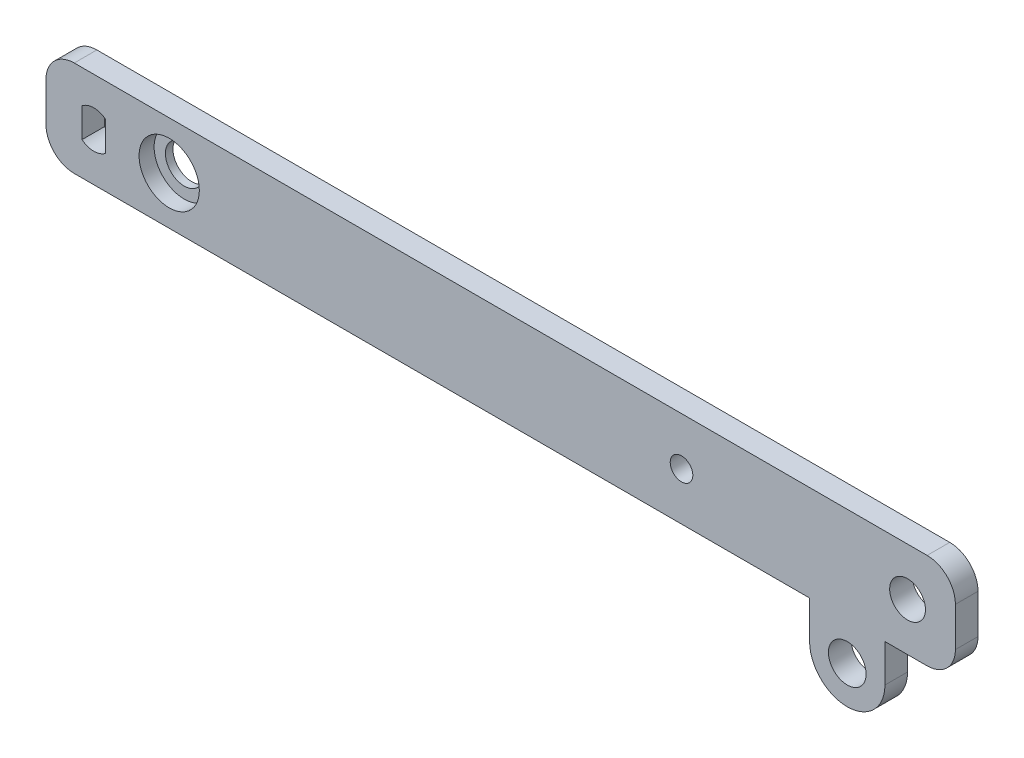
ISO-10303-21;
HEADER;
FILE_DESCRIPTION(('STEP AP214'),'2;1');
FILE_NAME('part.step','',(''),(''),'','','');
FILE_SCHEMA(('AUTOMOTIVE_DESIGN { 1 0 10303 214 1 1 1 1 }'));
ENDSEC;
DATA;
#1=APPLICATION_CONTEXT('core data for automotive mechanical design processes');
#2=APPLICATION_PROTOCOL_DEFINITION('international standard','automotive_design',2000,#1);
#3=PRODUCT_CONTEXT('',#1,'mechanical');
#4=PRODUCT('Part','Part','',(#3));
#5=PRODUCT_RELATED_PRODUCT_CATEGORY('part','',(#4));
#6=PRODUCT_DEFINITION_FORMATION('','',#4);
#7=PRODUCT_DEFINITION_CONTEXT('part definition',#1,'design');
#8=PRODUCT_DEFINITION('design','',#6,#7);
#9=PRODUCT_DEFINITION_SHAPE('','',#8);
#10=(LENGTH_UNIT() NAMED_UNIT(*) SI_UNIT(.MILLI.,.METRE.));
#11=(NAMED_UNIT(*) PLANE_ANGLE_UNIT() SI_UNIT($,.RADIAN.));
#12=(NAMED_UNIT(*) SI_UNIT($,.STERADIAN.) SOLID_ANGLE_UNIT());
#13=UNCERTAINTY_MEASURE_WITH_UNIT(LENGTH_MEASURE(1.E-05),#10,'distance_accuracy_value','');
#14=(GEOMETRIC_REPRESENTATION_CONTEXT(3) GLOBAL_UNCERTAINTY_ASSIGNED_CONTEXT((#13)) GLOBAL_UNIT_ASSIGNED_CONTEXT((#10,
#11,#12)) REPRESENTATION_CONTEXT('',''));
#15=CARTESIAN_POINT('',(0.,0.,0.));
#16=DIRECTION('',(0.,0.,1.));
#17=DIRECTION('',(1.,0.,0.));
#18=AXIS2_PLACEMENT_3D('',#15,#16,#17);
#19=CARTESIAN_POINT('',(40.,0.,12.));
#20=DIRECTION('',(0.,0.,-1.));
#21=DIRECTION('',(-1.,0.,0.));
#22=AXIS2_PLACEMENT_3D('',#19,#20,#21);
#23=CYLINDRICAL_SURFACE('',#22,10.);
#24=CARTESIAN_POINT('',(40.,0.,0.));
#25=DIRECTION('',(0.,0.,1.));
#26=DIRECTION('',(1.,0.,0.));
#27=AXIS2_PLACEMENT_3D('',#24,#25,#26);
#28=CIRCLE('',#27,10.);
#29=CARTESIAN_POINT('',(50.,0.,0.));
#30=VERTEX_POINT('',#29);
#31=EDGE_CURVE('E188',#30,#30,#28,.T.);
#32=ORIENTED_EDGE('',*,*,#31,.F.);
#33=EDGE_LOOP('',(#32));
#34=FACE_BOUND('',#33,.T.);
#35=CARTESIAN_POINT('',(40.,0.,4.));
#36=DIRECTION('',(0.,0.,1.));
#37=DIRECTION('',(1.,0.,0.));
#38=AXIS2_PLACEMENT_3D('',#35,#36,#37);
#39=CIRCLE('',#38,10.);
#40=CARTESIAN_POINT('',(50.,0.,4.));
#41=VERTEX_POINT('',#40);
#42=EDGE_CURVE('E41',#41,#41,#39,.T.);
#43=ORIENTED_EDGE('',*,*,#42,.T.);
#44=EDGE_LOOP('',(#43));
#45=FACE_BOUND('',#44,.T.);
#46=ADVANCED_FACE('F37',(#34,#45),#23,.F.);
#47=CARTESIAN_POINT('',(400.,-45.4,12.));
#48=DIRECTION('',(0.,0.,1.));
#49=DIRECTION('',(1.,0.,0.));
#50=AXIS2_PLACEMENT_3D('',#47,#48,#49);
#51=PLANE('',#50);
#52=CARTESIAN_POINT('',(40.,0.,12.));
#53=DIRECTION('',(0.,0.,1.));
#54=DIRECTION('',(1.,0.,0.));
#55=AXIS2_PLACEMENT_3D('',#52,#53,#54);
#56=CIRCLE('',#55,16.);
#57=CARTESIAN_POINT('',(56.,0.,12.));
#58=VERTEX_POINT('',#57);
#59=EDGE_CURVE('E494',#58,#58,#56,.T.);
#60=ORIENTED_EDGE('',*,*,#59,.F.);
#61=EDGE_LOOP('',(#60));
#62=FACE_BOUND('',#61,.T.);
#63=CARTESIAN_POINT('',(312.,0.,12.));
#64=DIRECTION('',(0.,0.,1.));
#65=DIRECTION('',(1.,0.,0.));
#66=AXIS2_PLACEMENT_3D('',#63,#64,#65);
#67=CIRCLE('',#66,5.99999999999999);
#68=CARTESIAN_POINT('',(318.,0.,12.));
#69=VERTEX_POINT('',#68);
#70=EDGE_CURVE('E478',#69,#69,#67,.T.);
#71=ORIENTED_EDGE('',*,*,#70,.F.);
#72=EDGE_LOOP('',(#71));
#73=FACE_BOUND('',#72,.T.);
#74=DIRECTION('',(0.,-1.,0.));
#75=VECTOR('',#74,1.);
#76=CARTESIAN_POINT('',(-6.28,-7.7821333835909,12.));
#77=LINE('',#76,#75);
#78=CARTESIAN_POINT('',(-6.28,7.7821333835909,12.));
#79=VERTEX_POINT('',#78);
#80=CARTESIAN_POINT('',(-6.28000000000001,-7.7821333835909,12.));
#81=VERTEX_POINT('',#80);
#82=EDGE_CURVE('E165',#79,#81,#77,.T.);
#83=ORIENTED_EDGE('',*,*,#82,.F.);
#84=CARTESIAN_POINT('',(0.,0.,12.));
#85=DIRECTION('',(0.,0.,1.));
#86=DIRECTION('',(1.,0.,0.));
#87=AXIS2_PLACEMENT_3D('',#84,#85,#86);
#88=CIRCLE('',#87,10.);
#89=CARTESIAN_POINT('',(6.28,7.7821333835909,12.));
#90=VERTEX_POINT('',#89);
#91=EDGE_CURVE('E155',#90,#79,#88,.T.);
#92=ORIENTED_EDGE('',*,*,#91,.F.);
#93=DIRECTION('',(0.,1.,0.));
#94=VECTOR('',#93,1.);
#95=CARTESIAN_POINT('',(6.28,-7.7821333835909,12.));
#96=LINE('',#95,#94);
#97=CARTESIAN_POINT('',(6.28000000000001,-7.7821333835909,12.));
#98=VERTEX_POINT('',#97);
#99=EDGE_CURVE('E181',#98,#90,#96,.T.);
#100=ORIENTED_EDGE('',*,*,#99,.F.);
#101=CARTESIAN_POINT('',(0.,0.,12.));
#102=DIRECTION('',(0.,0.,1.));
#103=DIRECTION('',(1.,0.,0.));
#104=AXIS2_PLACEMENT_3D('',#101,#102,#103);
#105=CIRCLE('',#104,10.);
#106=EDGE_CURVE('E179',#81,#98,#105,.T.);
#107=ORIENTED_EDGE('',*,*,#106,.F.);
#108=EDGE_LOOP('',(#83,#92,#100,#107));
#109=FACE_BOUND('',#108,.T.);
#110=DIRECTION('',(1.,0.,0.));
#111=VECTOR('',#110,1.);
#112=CARTESIAN_POINT('',(420.,-25.4,12.));
#113=LINE('',#112,#111);
#114=CARTESIAN_POINT('',(420.,-25.4,12.));
#115=VERTEX_POINT('',#114);
#116=CARTESIAN_POINT('',(442.4,-25.4,12.));
#117=VERTEX_POINT('',#116);
#118=EDGE_CURVE('E217',#115,#117,#113,.T.);
#119=ORIENTED_EDGE('',*,*,#118,.T.);
#120=CARTESIAN_POINT('',(442.4,-10.4,12.));
#121=DIRECTION('',(0.,0.,1.));
#122=DIRECTION('',(1.,0.,0.));
#123=AXIS2_PLACEMENT_3D('',#120,#121,#122);
#124=CIRCLE('',#123,15.);
#125=CARTESIAN_POINT('',(457.4,-10.4,12.));
#126=VERTEX_POINT('',#125);
#127=EDGE_CURVE('E46',#117,#126,#124,.T.);
#128=ORIENTED_EDGE('',*,*,#127,.T.);
#129=DIRECTION('',(0.,1.,0.));
#130=VECTOR('',#129,1.);
#131=CARTESIAN_POINT('',(457.4,25.4,12.));
#132=LINE('',#131,#130);
#133=CARTESIAN_POINT('',(457.4,10.4,12.));
#134=VERTEX_POINT('',#133);
#135=EDGE_CURVE('E219',#126,#134,#132,.T.);
#136=ORIENTED_EDGE('',*,*,#135,.T.);
#137=CARTESIAN_POINT('',(442.4,10.4,12.));
#138=DIRECTION('',(0.,0.,1.));
#139=DIRECTION('',(1.,0.,0.));
#140=AXIS2_PLACEMENT_3D('',#137,#138,#139);
#141=CIRCLE('',#140,15.);
#142=CARTESIAN_POINT('',(442.4,25.4,12.));
#143=VERTEX_POINT('',#142);
#144=EDGE_CURVE('E53',#134,#143,#141,.T.);
#145=ORIENTED_EDGE('',*,*,#144,.T.);
#146=DIRECTION('',(-1.,0.,0.));
#147=VECTOR('',#146,1.);
#148=CARTESIAN_POINT('',(-25.4,25.4,12.));
#149=LINE('',#148,#147);
#150=CARTESIAN_POINT('',(-10.4,25.4,12.));
#151=VERTEX_POINT('',#150);
#152=EDGE_CURVE('E221',#143,#151,#149,.T.);
#153=ORIENTED_EDGE('',*,*,#152,.T.);
#154=CARTESIAN_POINT('',(-10.4,10.4,12.));
#155=DIRECTION('',(0.,0.,1.));
#156=DIRECTION('',(1.,0.,0.));
#157=AXIS2_PLACEMENT_3D('',#154,#155,#156);
#158=CIRCLE('',#157,15.);
#159=CARTESIAN_POINT('',(-25.4,10.4,12.));
#160=VERTEX_POINT('',#159);
#161=EDGE_CURVE('E264',#151,#160,#158,.T.);
#162=ORIENTED_EDGE('',*,*,#161,.T.);
#163=DIRECTION('',(0.,-1.,0.));
#164=VECTOR('',#163,1.);
#165=CARTESIAN_POINT('',(-25.4,25.4,12.));
#166=LINE('',#165,#164);
#167=CARTESIAN_POINT('',(-25.4,-10.4,12.));
#168=VERTEX_POINT('',#167);
#169=EDGE_CURVE('E205',#160,#168,#166,.T.);
#170=ORIENTED_EDGE('',*,*,#169,.T.);
#171=CARTESIAN_POINT('',(-10.4,-10.4,12.));
#172=DIRECTION('',(0.,0.,1.));
#173=DIRECTION('',(1.,0.,0.));
#174=AXIS2_PLACEMENT_3D('',#171,#172,#173);
#175=CIRCLE('',#174,15.);
#176=CARTESIAN_POINT('',(-10.4,-25.4,12.));
#177=VERTEX_POINT('',#176);
#178=EDGE_CURVE('E266',#168,#177,#175,.T.);
#179=ORIENTED_EDGE('',*,*,#178,.T.);
#180=DIRECTION('',(1.,0.,0.));
#181=VECTOR('',#180,1.);
#182=CARTESIAN_POINT('',(-25.4,-25.4,12.));
#183=LINE('',#182,#181);
#184=CARTESIAN_POINT('',(380.,-25.4,12.));
#185=VERTEX_POINT('',#184);
#186=EDGE_CURVE('E208',#177,#185,#183,.T.);
#187=ORIENTED_EDGE('',*,*,#186,.T.);
#188=DIRECTION('',(0.,-1.,0.));
#189=VECTOR('',#188,1.);
#190=CARTESIAN_POINT('',(380.,-45.4,12.));
#191=LINE('',#190,#189);
#192=CARTESIAN_POINT('',(380.,-45.4,12.));
#193=VERTEX_POINT('',#192);
#194=EDGE_CURVE('E211',#185,#193,#191,.T.);
#195=ORIENTED_EDGE('',*,*,#194,.T.);
#196=CARTESIAN_POINT('',(400.,-45.4,12.));
#197=DIRECTION('',(0.,0.,1.));
#198=DIRECTION('',(1.,0.,0.));
#199=AXIS2_PLACEMENT_3D('',#196,#197,#198);
#200=CIRCLE('',#199,20.);
#201=CARTESIAN_POINT('',(420.,-45.4,12.));
#202=VERTEX_POINT('',#201);
#203=EDGE_CURVE('E213',#193,#202,#200,.T.);
#204=ORIENTED_EDGE('',*,*,#203,.T.);
#205=DIRECTION('',(0.,1.,0.));
#206=VECTOR('',#205,1.);
#207=CARTESIAN_POINT('',(420.,-45.4,12.));
#208=LINE('',#207,#206);
#209=EDGE_CURVE('E215',#202,#115,#208,.T.);
#210=ORIENTED_EDGE('',*,*,#209,.T.);
#211=EDGE_LOOP('',(#119,#128,#136,#145,#153,#162,#170,#179,#187,#195,#204,#210));
#212=FACE_BOUND('',#211,.T.);
#213=CARTESIAN_POINT('',(432.,0.,12.));
#214=DIRECTION('',(0.,0.,1.));
#215=DIRECTION('',(1.,0.,0.));
#216=AXIS2_PLACEMENT_3D('',#213,#214,#215);
#217=CIRCLE('',#216,9.50000000000001);
#218=CARTESIAN_POINT('',(441.5,0.,12.));
#219=VERTEX_POINT('',#218);
#220=EDGE_CURVE('E199',#219,#219,#217,.T.);
#221=ORIENTED_EDGE('',*,*,#220,.F.);
#222=EDGE_LOOP('',(#221));
#223=FACE_BOUND('',#222,.T.);
#224=CARTESIAN_POINT('',(400.,-45.4,12.));
#225=DIRECTION('',(0.,0.,1.));
#226=DIRECTION('',(1.,0.,0.));
#227=AXIS2_PLACEMENT_3D('',#224,#225,#226);
#228=CIRCLE('',#227,9.99999999999998);
#229=CARTESIAN_POINT('',(410.,-45.4,12.));
#230=VERTEX_POINT('',#229);
#231=EDGE_CURVE('E464',#230,#230,#228,.T.);
#232=ORIENTED_EDGE('',*,*,#231,.F.);
#233=EDGE_LOOP('',(#232));
#234=FACE_BOUND('',#233,.T.);
#235=ADVANCED_FACE('F177',(#62,#73,#109,#212,#223,#234),#51,.T.);
#236=CARTESIAN_POINT('',(400.,-45.4,0.));
#237=DIRECTION('',(0.,0.,1.));
#238=DIRECTION('',(1.,0.,0.));
#239=AXIS2_PLACEMENT_3D('',#236,#237,#238);
#240=PLANE('',#239);
#241=CARTESIAN_POINT('',(66.4370013321474,-11.2982209536767,0.));
#242=DIRECTION('',(0.,0.,-1.));
#243=DIRECTION('',(-1.,0.,0.));
#244=AXIS2_PLACEMENT_3D('',#241,#242,#243);
#245=CIRCLE('',#244,2.14495620677024);
#246=CARTESIAN_POINT('',(64.2920451253771,-11.2982209536767,0.));
#247=VERTEX_POINT('',#246);
#248=EDGE_CURVE('E474',#247,#247,#245,.T.);
#249=ORIENTED_EDGE('',*,*,#248,.F.);
#250=EDGE_LOOP('',(#249));
#251=FACE_BOUND('',#250,.T.);
#252=CARTESIAN_POINT('',(312.,0.,0.));
#253=DIRECTION('',(0.,0.,1.));
#254=DIRECTION('',(1.,0.,0.));
#255=AXIS2_PLACEMENT_3D('',#252,#253,#254);
#256=CIRCLE('',#255,5.99999999999999);
#257=CARTESIAN_POINT('',(318.,0.,0.));
#258=VERTEX_POINT('',#257);
#259=EDGE_CURVE('E471',#258,#258,#256,.T.);
#260=ORIENTED_EDGE('',*,*,#259,.T.);
#261=EDGE_LOOP('',(#260));
#262=FACE_BOUND('',#261,.T.);
#263=CARTESIAN_POINT('',(0.,0.,0.));
#264=DIRECTION('',(0.,0.,1.));
#265=DIRECTION('',(1.,0.,0.));
#266=AXIS2_PLACEMENT_3D('',#263,#264,#265);
#267=CIRCLE('',#266,10.);
#268=CARTESIAN_POINT('',(6.28000000000001,7.7821333835909,0.));
#269=VERTEX_POINT('',#268);
#270=CARTESIAN_POINT('',(-6.28,7.7821333835909,0.));
#271=VERTEX_POINT('',#270);
#272=EDGE_CURVE('E186',#269,#271,#267,.T.);
#273=ORIENTED_EDGE('',*,*,#272,.T.);
#274=DIRECTION('',(0.,-1.,0.));
#275=VECTOR('',#274,1.);
#276=CARTESIAN_POINT('',(-6.28,-7.7821333835909,0.));
#277=LINE('',#276,#275);
#278=CARTESIAN_POINT('',(-6.28000000000001,-7.7821333835909,0.));
#279=VERTEX_POINT('',#278);
#280=EDGE_CURVE('E172',#271,#279,#277,.T.);
#281=ORIENTED_EDGE('',*,*,#280,.T.);
#282=CARTESIAN_POINT('',(0.,0.,0.));
#283=DIRECTION('',(0.,0.,1.));
#284=DIRECTION('',(1.,0.,0.));
#285=AXIS2_PLACEMENT_3D('',#282,#283,#284);
#286=CIRCLE('',#285,10.);
#287=CARTESIAN_POINT('',(6.28,-7.7821333835909,0.));
#288=VERTEX_POINT('',#287);
#289=EDGE_CURVE('E190',#279,#288,#286,.T.);
#290=ORIENTED_EDGE('',*,*,#289,.T.);
#291=DIRECTION('',(0.,1.,0.));
#292=VECTOR('',#291,1.);
#293=CARTESIAN_POINT('',(6.28,-7.7821333835909,0.));
#294=LINE('',#293,#292);
#295=EDGE_CURVE('E166',#288,#269,#294,.T.);
#296=ORIENTED_EDGE('',*,*,#295,.T.);
#297=EDGE_LOOP('',(#273,#281,#290,#296));
#298=FACE_BOUND('',#297,.T.);
#299=DIRECTION('',(0.,1.,0.));
#300=VECTOR('',#299,1.);
#301=CARTESIAN_POINT('',(457.4,25.4,0.));
#302=LINE('',#301,#300);
#303=CARTESIAN_POINT('',(457.4,-10.4,0.));
#304=VERTEX_POINT('',#303);
#305=CARTESIAN_POINT('',(457.4,10.4,0.));
#306=VERTEX_POINT('',#305);
#307=EDGE_CURVE('E236',#304,#306,#302,.T.);
#308=ORIENTED_EDGE('',*,*,#307,.F.);
#309=CARTESIAN_POINT('',(442.4,-10.4,0.));
#310=DIRECTION('',(0.,0.,1.));
#311=DIRECTION('',(1.,0.,0.));
#312=AXIS2_PLACEMENT_3D('',#309,#310,#311);
#313=CIRCLE('',#312,15.);
#314=CARTESIAN_POINT('',(442.4,-25.4,0.));
#315=VERTEX_POINT('',#314);
#316=EDGE_CURVE('E278',#304,#315,#313,.F.);
#317=ORIENTED_EDGE('',*,*,#316,.T.);
#318=DIRECTION('',(1.,0.,0.));
#319=VECTOR('',#318,1.);
#320=CARTESIAN_POINT('',(420.,-25.4,0.));
#321=LINE('',#320,#319);
#322=CARTESIAN_POINT('',(420.,-25.4,0.));
#323=VERTEX_POINT('',#322);
#324=EDGE_CURVE('E234',#323,#315,#321,.T.);
#325=ORIENTED_EDGE('',*,*,#324,.F.);
#326=DIRECTION('',(0.,1.,0.));
#327=VECTOR('',#326,1.);
#328=CARTESIAN_POINT('',(420.,-45.4,0.));
#329=LINE('',#328,#327);
#330=CARTESIAN_POINT('',(420.,-45.4,0.));
#331=VERTEX_POINT('',#330);
#332=EDGE_CURVE('E232',#331,#323,#329,.T.);
#333=ORIENTED_EDGE('',*,*,#332,.F.);
#334=CARTESIAN_POINT('',(400.,-45.4,0.));
#335=DIRECTION('',(0.,0.,1.));
#336=DIRECTION('',(1.,0.,0.));
#337=AXIS2_PLACEMENT_3D('',#334,#335,#336);
#338=CIRCLE('',#337,20.);
#339=CARTESIAN_POINT('',(380.,-45.4,0.));
#340=VERTEX_POINT('',#339);
#341=EDGE_CURVE('E230',#340,#331,#338,.T.);
#342=ORIENTED_EDGE('',*,*,#341,.F.);
#343=DIRECTION('',(0.,-1.,0.));
#344=VECTOR('',#343,1.);
#345=CARTESIAN_POINT('',(380.,-45.4,0.));
#346=LINE('',#345,#344);
#347=CARTESIAN_POINT('',(380.,-25.4,0.));
#348=VERTEX_POINT('',#347);
#349=EDGE_CURVE('E228',#348,#340,#346,.T.);
#350=ORIENTED_EDGE('',*,*,#349,.F.);
#351=DIRECTION('',(1.,0.,0.));
#352=VECTOR('',#351,1.);
#353=CARTESIAN_POINT('',(-25.4,-25.4,0.));
#354=LINE('',#353,#352);
#355=CARTESIAN_POINT('',(-10.4,-25.4,0.));
#356=VERTEX_POINT('',#355);
#357=EDGE_CURVE('E226',#356,#348,#354,.T.);
#358=ORIENTED_EDGE('',*,*,#357,.F.);
#359=CARTESIAN_POINT('',(-10.4,-10.4,0.));
#360=DIRECTION('',(0.,0.,1.));
#361=DIRECTION('',(1.,0.,0.));
#362=AXIS2_PLACEMENT_3D('',#359,#360,#361);
#363=CIRCLE('',#362,15.);
#364=CARTESIAN_POINT('',(-25.4,-10.4,0.));
#365=VERTEX_POINT('',#364);
#366=EDGE_CURVE('E257',#356,#365,#363,.F.);
#367=ORIENTED_EDGE('',*,*,#366,.T.);
#368=DIRECTION('',(0.,-1.,0.));
#369=VECTOR('',#368,1.);
#370=CARTESIAN_POINT('',(-25.4,25.4,0.));
#371=LINE('',#370,#369);
#372=CARTESIAN_POINT('',(-25.4,10.4,0.));
#373=VERTEX_POINT('',#372);
#374=EDGE_CURVE('E202',#373,#365,#371,.T.);
#375=ORIENTED_EDGE('',*,*,#374,.F.);
#376=CARTESIAN_POINT('',(-10.4,10.4,0.));
#377=DIRECTION('',(0.,0.,1.));
#378=DIRECTION('',(1.,0.,0.));
#379=AXIS2_PLACEMENT_3D('',#376,#377,#378);
#380=CIRCLE('',#379,15.);
#381=CARTESIAN_POINT('',(-10.4,25.4,0.));
#382=VERTEX_POINT('',#381);
#383=EDGE_CURVE('E254',#373,#382,#380,.F.);
#384=ORIENTED_EDGE('',*,*,#383,.T.);
#385=DIRECTION('',(-1.,0.,0.));
#386=VECTOR('',#385,1.);
#387=CARTESIAN_POINT('',(-25.4,25.4,0.));
#388=LINE('',#387,#386);
#389=CARTESIAN_POINT('',(442.4,25.4,0.));
#390=VERTEX_POINT('',#389);
#391=EDGE_CURVE('E209',#390,#382,#388,.T.);
#392=ORIENTED_EDGE('',*,*,#391,.F.);
#393=CARTESIAN_POINT('',(442.4,10.4,0.));
#394=DIRECTION('',(0.,0.,1.));
#395=DIRECTION('',(1.,0.,0.));
#396=AXIS2_PLACEMENT_3D('',#393,#394,#395);
#397=CIRCLE('',#396,15.);
#398=EDGE_CURVE('E276',#390,#306,#397,.F.);
#399=ORIENTED_EDGE('',*,*,#398,.T.);
#400=EDGE_LOOP('',(#308,#317,#325,#333,#342,#350,#358,#367,#375,#384,#392,#399));
#401=FACE_BOUND('',#400,.T.);
#402=CARTESIAN_POINT('',(432.,0.,0.));
#403=DIRECTION('',(0.,0.,1.));
#404=DIRECTION('',(1.,0.,0.));
#405=AXIS2_PLACEMENT_3D('',#402,#403,#404);
#406=CIRCLE('',#405,9.50000000000001);
#407=CARTESIAN_POINT('',(441.5,0.,0.));
#408=VERTEX_POINT('',#407);
#409=EDGE_CURVE('E173',#408,#408,#406,.T.);
#410=ORIENTED_EDGE('',*,*,#409,.T.);
#411=EDGE_LOOP('',(#410));
#412=FACE_BOUND('',#411,.T.);
#413=ORIENTED_EDGE('',*,*,#31,.T.);
#414=EDGE_LOOP('',(#413));
#415=FACE_BOUND('',#414,.T.);
#416=CARTESIAN_POINT('',(400.,-45.4,0.));
#417=DIRECTION('',(0.,0.,1.));
#418=DIRECTION('',(1.,0.,0.));
#419=AXIS2_PLACEMENT_3D('',#416,#417,#418);
#420=CIRCLE('',#419,9.99999999999998);
#421=CARTESIAN_POINT('',(410.,-45.4,0.));
#422=VERTEX_POINT('',#421);
#423=EDGE_CURVE('E467',#422,#422,#420,.T.);
#424=ORIENTED_EDGE('',*,*,#423,.T.);
#425=EDGE_LOOP('',(#424));
#426=FACE_BOUND('',#425,.T.);
#427=ADVANCED_FACE('F294',(#251,#262,#298,#401,#412,#415,#426),#240,.F.);
#428=CARTESIAN_POINT('',(-25.4,25.4,12.));
#429=DIRECTION('',(1.,0.,0.));
#430=DIRECTION('',(0.,1.,0.));
#431=AXIS2_PLACEMENT_3D('',#428,#429,#430);
#432=PLANE('',#431);
#433=ORIENTED_EDGE('',*,*,#374,.T.);
#434=DIRECTION('',(0.,0.,-1.));
#435=VECTOR('',#434,1.);
#436=CARTESIAN_POINT('',(-25.4,-10.4,12.));
#437=LINE('',#436,#435);
#438=EDGE_CURVE('E262',#365,#168,#437,.F.);
#439=ORIENTED_EDGE('',*,*,#438,.T.);
#440=ORIENTED_EDGE('',*,*,#169,.F.);
#441=DIRECTION('',(0.,0.,-1.));
#442=VECTOR('',#441,1.);
#443=CARTESIAN_POINT('',(-25.4,10.4,12.));
#444=LINE('',#443,#442);
#445=EDGE_CURVE('E259',#160,#373,#444,.T.);
#446=ORIENTED_EDGE('',*,*,#445,.T.);
#447=EDGE_LOOP('',(#433,#439,#440,#446));
#448=FACE_BOUND('',#447,.T.);
#449=ADVANCED_FACE('F322',(#448),#432,.F.);
#450=CARTESIAN_POINT('',(-25.4,-25.4,12.));
#451=DIRECTION('',(0.,1.,0.));
#452=DIRECTION('',(0.,0.,1.));
#453=AXIS2_PLACEMENT_3D('',#450,#451,#452);
#454=PLANE('',#453);
#455=ORIENTED_EDGE('',*,*,#186,.F.);
#456=DIRECTION('',(0.,0.,-1.));
#457=VECTOR('',#456,1.);
#458=CARTESIAN_POINT('',(-10.4,-25.4,12.));
#459=LINE('',#458,#457);
#460=EDGE_CURVE('E251',#177,#356,#459,.T.);
#461=ORIENTED_EDGE('',*,*,#460,.T.);
#462=ORIENTED_EDGE('',*,*,#357,.T.);
#463=DIRECTION('',(0.,0.,-1.));
#464=VECTOR('',#463,1.);
#465=CARTESIAN_POINT('',(380.,-25.4,12.));
#466=LINE('',#465,#464);
#467=EDGE_CURVE('E248',#185,#348,#466,.T.);
#468=ORIENTED_EDGE('',*,*,#467,.F.);
#469=EDGE_LOOP('',(#455,#461,#462,#468));
#470=FACE_BOUND('',#469,.T.);
#471=ADVANCED_FACE('F316',(#470),#454,.F.);
#472=CARTESIAN_POINT('',(380.,-45.4,12.));
#473=DIRECTION('',(1.,0.,0.));
#474=DIRECTION('',(0.,0.,-1.));
#475=AXIS2_PLACEMENT_3D('',#472,#473,#474);
#476=PLANE('',#475);
#477=ORIENTED_EDGE('',*,*,#349,.T.);
#478=DIRECTION('',(0.,0.,-1.));
#479=VECTOR('',#478,1.);
#480=CARTESIAN_POINT('',(380.,-45.4,12.));
#481=LINE('',#480,#479);
#482=EDGE_CURVE('E245',#193,#340,#481,.T.);
#483=ORIENTED_EDGE('',*,*,#482,.F.);
#484=ORIENTED_EDGE('',*,*,#194,.F.);
#485=ORIENTED_EDGE('',*,*,#467,.T.);
#486=EDGE_LOOP('',(#477,#483,#484,#485));
#487=FACE_BOUND('',#486,.T.);
#488=ADVANCED_FACE('F312',(#487),#476,.F.);
#489=CARTESIAN_POINT('',(400.,-45.4,12.));
#490=DIRECTION('',(0.,0.,-1.));
#491=DIRECTION('',(-1.,0.,0.));
#492=AXIS2_PLACEMENT_3D('',#489,#490,#491);
#493=CYLINDRICAL_SURFACE('',#492,20.);
#494=ORIENTED_EDGE('',*,*,#341,.T.);
#495=DIRECTION('',(0.,0.,-1.));
#496=VECTOR('',#495,1.);
#497=CARTESIAN_POINT('',(420.,-45.4,12.));
#498=LINE('',#497,#496);
#499=EDGE_CURVE('E242',#202,#331,#498,.T.);
#500=ORIENTED_EDGE('',*,*,#499,.F.);
#501=ORIENTED_EDGE('',*,*,#203,.F.);
#502=ORIENTED_EDGE('',*,*,#482,.T.);
#503=EDGE_LOOP('',(#494,#500,#501,#502));
#504=FACE_BOUND('',#503,.T.);
#505=ADVANCED_FACE('F307',(#504),#493,.T.);
#506=CARTESIAN_POINT('',(420.,-45.4,12.));
#507=DIRECTION('',(-1.,0.,0.));
#508=DIRECTION('',(0.,0.,1.));
#509=AXIS2_PLACEMENT_3D('',#506,#507,#508);
#510=PLANE('',#509);
#511=ORIENTED_EDGE('',*,*,#332,.T.);
#512=DIRECTION('',(0.,0.,-1.));
#513=VECTOR('',#512,1.);
#514=CARTESIAN_POINT('',(420.,-25.4,12.));
#515=LINE('',#514,#513);
#516=EDGE_CURVE('E223',#115,#323,#515,.T.);
#517=ORIENTED_EDGE('',*,*,#516,.F.);
#518=ORIENTED_EDGE('',*,*,#209,.F.);
#519=ORIENTED_EDGE('',*,*,#499,.T.);
#520=EDGE_LOOP('',(#511,#517,#518,#519));
#521=FACE_BOUND('',#520,.T.);
#522=ADVANCED_FACE('F301',(#521),#510,.F.);
#523=CARTESIAN_POINT('',(420.,-25.4,12.));
#524=DIRECTION('',(0.,1.,0.));
#525=DIRECTION('',(0.,0.,1.));
#526=AXIS2_PLACEMENT_3D('',#523,#524,#525);
#527=PLANE('',#526);
#528=ORIENTED_EDGE('',*,*,#324,.T.);
#529=DIRECTION('',(0.,0.,-1.));
#530=VECTOR('',#529,1.);
#531=CARTESIAN_POINT('',(442.4,-25.4,12.));
#532=LINE('',#531,#530);
#533=EDGE_CURVE('E61',#315,#117,#532,.F.);
#534=ORIENTED_EDGE('',*,*,#533,.T.);
#535=ORIENTED_EDGE('',*,*,#118,.F.);
#536=ORIENTED_EDGE('',*,*,#516,.T.);
#537=EDGE_LOOP('',(#528,#534,#535,#536));
#538=FACE_BOUND('',#537,.T.);
#539=ADVANCED_FACE('F297',(#538),#527,.F.);
#540=CARTESIAN_POINT('',(457.4,25.4,12.));
#541=DIRECTION('',(-1.,0.,0.));
#542=DIRECTION('',(0.,0.,1.));
#543=AXIS2_PLACEMENT_3D('',#540,#541,#542);
#544=PLANE('',#543);
#545=ORIENTED_EDGE('',*,*,#135,.F.);
#546=DIRECTION('',(0.,0.,-1.));
#547=VECTOR('',#546,1.);
#548=CARTESIAN_POINT('',(457.4,-10.4,12.));
#549=LINE('',#548,#547);
#550=EDGE_CURVE('E273',#126,#304,#549,.T.);
#551=ORIENTED_EDGE('',*,*,#550,.T.);
#552=ORIENTED_EDGE('',*,*,#307,.T.);
#553=DIRECTION('',(0.,0.,-1.));
#554=VECTOR('',#553,1.);
#555=CARTESIAN_POINT('',(457.4,10.4,12.));
#556=LINE('',#555,#554);
#557=EDGE_CURVE('E271',#306,#134,#556,.F.);
#558=ORIENTED_EDGE('',*,*,#557,.T.);
#559=EDGE_LOOP('',(#545,#551,#552,#558));
#560=FACE_BOUND('',#559,.T.);
#561=ADVANCED_FACE('F288',(#560),#544,.F.);
#562=CARTESIAN_POINT('',(-25.4,25.4,12.));
#563=DIRECTION('',(0.,-1.,0.));
#564=DIRECTION('',(0.,0.,-1.));
#565=AXIS2_PLACEMENT_3D('',#562,#563,#564);
#566=PLANE('',#565);
#567=ORIENTED_EDGE('',*,*,#152,.F.);
#568=DIRECTION('',(0.,0.,-1.));
#569=VECTOR('',#568,1.);
#570=CARTESIAN_POINT('',(442.4,25.4,12.));
#571=LINE('',#570,#569);
#572=EDGE_CURVE('E11',#143,#390,#571,.T.);
#573=ORIENTED_EDGE('',*,*,#572,.T.);
#574=ORIENTED_EDGE('',*,*,#391,.T.);
#575=DIRECTION('',(0.,0.,-1.));
#576=VECTOR('',#575,1.);
#577=CARTESIAN_POINT('',(-10.4,25.4,12.));
#578=LINE('',#577,#576);
#579=EDGE_CURVE('E268',#382,#151,#578,.F.);
#580=ORIENTED_EDGE('',*,*,#579,.T.);
#581=EDGE_LOOP('',(#567,#573,#574,#580));
#582=FACE_BOUND('',#581,.T.);
#583=ADVANCED_FACE('F333',(#582),#566,.F.);
#584=CARTESIAN_POINT('',(432.,0.,12.));
#585=DIRECTION('',(0.,0.,-1.));
#586=DIRECTION('',(-1.,0.,0.));
#587=AXIS2_PLACEMENT_3D('',#584,#585,#586);
#588=CYLINDRICAL_SURFACE('',#587,9.50000000000001);
#589=ORIENTED_EDGE('',*,*,#220,.T.);
#590=EDGE_LOOP('',(#589));
#591=FACE_BOUND('',#590,.T.);
#592=ORIENTED_EDGE('',*,*,#409,.F.);
#593=EDGE_LOOP('',(#592));
#594=FACE_BOUND('',#593,.T.);
#595=ADVANCED_FACE('F371',(#591,#594),#588,.F.);
#596=CARTESIAN_POINT('',(0.,0.,12.));
#597=DIRECTION('',(0.,0.,-1.));
#598=DIRECTION('',(-1.,0.,0.));
#599=AXIS2_PLACEMENT_3D('',#596,#597,#598);
#600=CYLINDRICAL_SURFACE('',#599,10.);
#601=ORIENTED_EDGE('',*,*,#272,.F.);
#602=DIRECTION('',(0.,0.,-1.));
#603=VECTOR('',#602,1.);
#604=CARTESIAN_POINT('',(6.28,7.7821333835909,12.));
#605=LINE('',#604,#603);
#606=EDGE_CURVE('E161',#90,#269,#605,.T.);
#607=ORIENTED_EDGE('',*,*,#606,.F.);
#608=ORIENTED_EDGE('',*,*,#91,.T.);
#609=DIRECTION('',(0.,0.,-1.));
#610=VECTOR('',#609,1.);
#611=CARTESIAN_POINT('',(-6.28,7.7821333835909,12.));
#612=LINE('',#611,#610);
#613=EDGE_CURVE('E158',#79,#271,#612,.T.);
#614=ORIENTED_EDGE('',*,*,#613,.T.);
#615=EDGE_LOOP('',(#601,#607,#608,#614));
#616=FACE_BOUND('',#615,.T.);
#617=ADVANCED_FACE('F157',(#616),#600,.F.);
#618=CARTESIAN_POINT('',(-6.28,-7.7821333835909,12.));
#619=DIRECTION('',(1.,0.,0.));
#620=DIRECTION('',(0.,0.,-1.));
#621=AXIS2_PLACEMENT_3D('',#618,#619,#620);
#622=PLANE('',#621);
#623=ORIENTED_EDGE('',*,*,#280,.F.);
#624=ORIENTED_EDGE('',*,*,#613,.F.);
#625=ORIENTED_EDGE('',*,*,#82,.T.);
#626=DIRECTION('',(0.,0.,-1.));
#627=VECTOR('',#626,1.);
#628=CARTESIAN_POINT('',(-6.28000000000001,-7.7821333835909,12.));
#629=LINE('',#628,#627);
#630=EDGE_CURVE('E174',#81,#279,#629,.T.);
#631=ORIENTED_EDGE('',*,*,#630,.T.);
#632=EDGE_LOOP('',(#623,#624,#625,#631));
#633=FACE_BOUND('',#632,.T.);
#634=ADVANCED_FACE('F169',(#633),#622,.T.);
#635=CARTESIAN_POINT('',(0.,0.,12.));
#636=DIRECTION('',(0.,0.,-1.));
#637=DIRECTION('',(-1.,0.,0.));
#638=AXIS2_PLACEMENT_3D('',#635,#636,#637);
#639=CYLINDRICAL_SURFACE('',#638,10.);
#640=ORIENTED_EDGE('',*,*,#289,.F.);
#641=ORIENTED_EDGE('',*,*,#630,.F.);
#642=ORIENTED_EDGE('',*,*,#106,.T.);
#643=DIRECTION('',(0.,0.,-1.));
#644=VECTOR('',#643,1.);
#645=CARTESIAN_POINT('',(6.28,-7.7821333835909,12.));
#646=LINE('',#645,#644);
#647=EDGE_CURVE('E196',#98,#288,#646,.T.);
#648=ORIENTED_EDGE('',*,*,#647,.T.);
#649=EDGE_LOOP('',(#640,#641,#642,#648));
#650=FACE_BOUND('',#649,.T.);
#651=ADVANCED_FACE('F362',(#650),#639,.F.);
#652=CARTESIAN_POINT('',(6.28,-7.7821333835909,12.));
#653=DIRECTION('',(-1.,0.,0.));
#654=DIRECTION('',(0.,0.,1.));
#655=AXIS2_PLACEMENT_3D('',#652,#653,#654);
#656=PLANE('',#655);
#657=ORIENTED_EDGE('',*,*,#295,.F.);
#658=ORIENTED_EDGE('',*,*,#647,.F.);
#659=ORIENTED_EDGE('',*,*,#99,.T.);
#660=ORIENTED_EDGE('',*,*,#606,.T.);
#661=EDGE_LOOP('',(#657,#658,#659,#660));
#662=FACE_BOUND('',#661,.T.);
#663=ADVANCED_FACE('F359',(#662),#656,.T.);
#664=CARTESIAN_POINT('',(312.,0.,12.));
#665=DIRECTION('',(0.,0.,-1.));
#666=DIRECTION('',(-1.,0.,0.));
#667=AXIS2_PLACEMENT_3D('',#664,#665,#666);
#668=CYLINDRICAL_SURFACE('',#667,5.99999999999999);
#669=ORIENTED_EDGE('',*,*,#70,.T.);
#670=EDGE_LOOP('',(#669));
#671=FACE_BOUND('',#670,.T.);
#672=ORIENTED_EDGE('',*,*,#259,.F.);
#673=EDGE_LOOP('',(#672));
#674=FACE_BOUND('',#673,.T.);
#675=ADVANCED_FACE('F357',(#671,#674),#668,.F.);
#676=CARTESIAN_POINT('',(400.,-45.4,12.));
#677=DIRECTION('',(0.,0.,-1.));
#678=DIRECTION('',(-1.,0.,0.));
#679=AXIS2_PLACEMENT_3D('',#676,#677,#678);
#680=CYLINDRICAL_SURFACE('',#679,9.99999999999998);
#681=ORIENTED_EDGE('',*,*,#231,.T.);
#682=EDGE_LOOP('',(#681));
#683=FACE_BOUND('',#682,.T.);
#684=ORIENTED_EDGE('',*,*,#423,.F.);
#685=EDGE_LOOP('',(#684));
#686=FACE_BOUND('',#685,.T.);
#687=ADVANCED_FACE('F453',(#683,#686),#680,.F.);
#688=CARTESIAN_POINT('',(66.4370013321474,-11.2982209536767,3.));
#689=DIRECTION('',(0.,0.,-1.));
#690=DIRECTION('',(-1.,0.,0.));
#691=AXIS2_PLACEMENT_3D('',#688,#689,#690);
#692=CYLINDRICAL_SURFACE('',#691,2.14495620677024);
#693=CARTESIAN_POINT('',(66.4370013321474,-11.2982209536767,3.));
#694=DIRECTION('',(0.,0.,-1.));
#695=DIRECTION('',(-1.,0.,0.));
#696=AXIS2_PLACEMENT_3D('',#693,#694,#695);
#697=CIRCLE('',#696,2.14495620677024);
#698=CARTESIAN_POINT('',(64.2920451253771,-11.2982209536767,3.));
#699=VERTEX_POINT('',#698);
#700=EDGE_CURVE('E469',#699,#699,#697,.T.);
#701=ORIENTED_EDGE('',*,*,#700,.F.);
#702=EDGE_LOOP('',(#701));
#703=FACE_BOUND('',#702,.T.);
#704=ORIENTED_EDGE('',*,*,#248,.T.);
#705=EDGE_LOOP('',(#704));
#706=FACE_BOUND('',#705,.T.);
#707=ADVANCED_FACE('F450',(#703,#706),#692,.F.);
#708=CARTESIAN_POINT('',(66.4370013321474,-11.2982209536767,3.));
#709=DIRECTION('',(0.,0.,-1.));
#710=DIRECTION('',(-1.,0.,0.));
#711=AXIS2_PLACEMENT_3D('',#708,#709,#710);
#712=PLANE('',#711);
#713=ORIENTED_EDGE('',*,*,#700,.T.);
#714=EDGE_LOOP('',(#713));
#715=FACE_BOUND('',#714,.T.);
#716=ADVANCED_FACE('F396',(#715),#712,.T.);
#717=CARTESIAN_POINT('',(-10.4,-10.4,12.));
#718=DIRECTION('',(0.,0.,-1.));
#719=DIRECTION('',(-1.,0.,0.));
#720=AXIS2_PLACEMENT_3D('',#717,#718,#719);
#721=CYLINDRICAL_SURFACE('',#720,15.);
#722=ORIENTED_EDGE('',*,*,#178,.F.);
#723=ORIENTED_EDGE('',*,*,#438,.F.);
#724=ORIENTED_EDGE('',*,*,#366,.F.);
#725=ORIENTED_EDGE('',*,*,#460,.F.);
#726=EDGE_LOOP('',(#722,#723,#724,#725));
#727=FACE_BOUND('',#726,.T.);
#728=ADVANCED_FACE('F326',(#727),#721,.T.);
#729=CARTESIAN_POINT('',(-10.4,10.4,12.));
#730=DIRECTION('',(0.,0.,-1.));
#731=DIRECTION('',(-1.,0.,0.));
#732=AXIS2_PLACEMENT_3D('',#729,#730,#731);
#733=CYLINDRICAL_SURFACE('',#732,15.);
#734=ORIENTED_EDGE('',*,*,#161,.F.);
#735=ORIENTED_EDGE('',*,*,#579,.F.);
#736=ORIENTED_EDGE('',*,*,#383,.F.);
#737=ORIENTED_EDGE('',*,*,#445,.F.);
#738=EDGE_LOOP('',(#734,#735,#736,#737));
#739=FACE_BOUND('',#738,.T.);
#740=ADVANCED_FACE('F329',(#739),#733,.T.);
#741=CARTESIAN_POINT('',(442.4,-10.4,12.));
#742=DIRECTION('',(0.,0.,-1.));
#743=DIRECTION('',(-1.,0.,0.));
#744=AXIS2_PLACEMENT_3D('',#741,#742,#743);
#745=CYLINDRICAL_SURFACE('',#744,15.);
#746=ORIENTED_EDGE('',*,*,#127,.F.);
#747=ORIENTED_EDGE('',*,*,#533,.F.);
#748=ORIENTED_EDGE('',*,*,#316,.F.);
#749=ORIENTED_EDGE('',*,*,#550,.F.);
#750=EDGE_LOOP('',(#746,#747,#748,#749));
#751=FACE_BOUND('',#750,.T.);
#752=ADVANCED_FACE('F291',(#751),#745,.T.);
#753=CARTESIAN_POINT('',(442.4,10.4,12.));
#754=DIRECTION('',(0.,0.,-1.));
#755=DIRECTION('',(-1.,0.,0.));
#756=AXIS2_PLACEMENT_3D('',#753,#754,#755);
#757=CYLINDRICAL_SURFACE('',#756,15.);
#758=ORIENTED_EDGE('',*,*,#144,.F.);
#759=ORIENTED_EDGE('',*,*,#557,.F.);
#760=ORIENTED_EDGE('',*,*,#398,.F.);
#761=ORIENTED_EDGE('',*,*,#572,.F.);
#762=EDGE_LOOP('',(#758,#759,#760,#761));
#763=FACE_BOUND('',#762,.T.);
#764=ADVANCED_FACE('F39',(#763),#757,.T.);
#765=CARTESIAN_POINT('',(40.,0.,4.));
#766=DIRECTION('',(0.,0.,1.));
#767=DIRECTION('',(1.,0.,0.));
#768=AXIS2_PLACEMENT_3D('',#765,#766,#767);
#769=CYLINDRICAL_SURFACE('',#768,16.);
#770=CARTESIAN_POINT('',(40.,0.,4.));
#771=DIRECTION('',(0.,0.,1.));
#772=DIRECTION('',(1.,0.,0.));
#773=AXIS2_PLACEMENT_3D('',#770,#771,#772);
#774=CIRCLE('',#773,16.);
#775=CARTESIAN_POINT('',(56.,0.,4.));
#776=VERTEX_POINT('',#775);
#777=EDGE_CURVE('E497',#776,#776,#774,.T.);
#778=ORIENTED_EDGE('',*,*,#777,.F.);
#779=EDGE_LOOP('',(#778));
#780=FACE_BOUND('',#779,.T.);
#781=ORIENTED_EDGE('',*,*,#59,.T.);
#782=EDGE_LOOP('',(#781));
#783=FACE_BOUND('',#782,.T.);
#784=ADVANCED_FACE('F337',(#780,#783),#769,.F.);
#785=CARTESIAN_POINT('',(40.,0.,4.));
#786=DIRECTION('',(0.,0.,1.));
#787=DIRECTION('',(1.,0.,0.));
#788=AXIS2_PLACEMENT_3D('',#785,#786,#787);
#789=PLANE('',#788);
#790=ORIENTED_EDGE('',*,*,#42,.F.);
#791=EDGE_LOOP('',(#790));
#792=FACE_BOUND('',#791,.T.);
#793=ORIENTED_EDGE('',*,*,#777,.T.);
#794=EDGE_LOOP('',(#793));
#795=FACE_BOUND('',#794,.T.);
#796=ADVANCED_FACE('F342',(#792,#795),#789,.T.);
#797=CLOSED_SHELL('',(#46,#235,#427,#449,#471,#488,#505,#522,#539,#561,#583,#595,#617,#634,#651,
#663,#675,#687,#707,#716,#728,#740,#752,#764,#784,#796));
#798=MANIFOLD_SOLID_BREP('B2',#797);
#799=ADVANCED_BREP_SHAPE_REPRESENTATION('',(#18,#798),#14);
#800=SHAPE_DEFINITION_REPRESENTATION(#9,#799);
ENDSEC;
END-ISO-10303-21;
